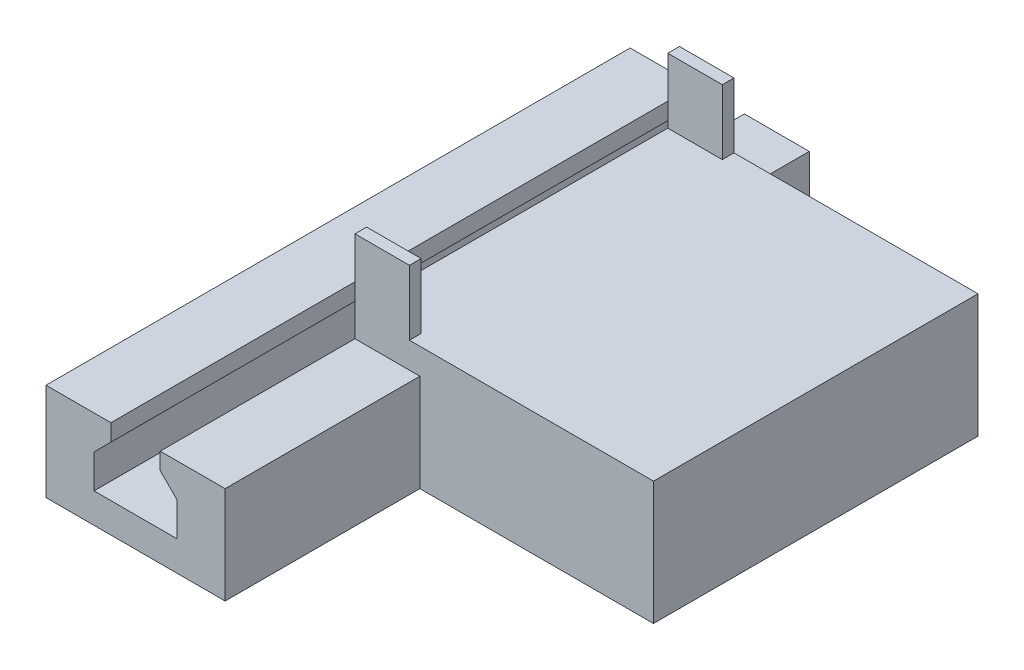
ISO-10303-21;
HEADER;
FILE_DESCRIPTION(('STEP AP214'),'2;1');
FILE_NAME('part.step','',(''),(''),'','','');
FILE_SCHEMA(('AUTOMOTIVE_DESIGN { 1 0 10303 214 1 1 1 1 }'));
ENDSEC;
DATA;
#1=APPLICATION_CONTEXT('core data for automotive mechanical design processes');
#2=APPLICATION_PROTOCOL_DEFINITION('international standard','automotive_design',2000,#1);
#3=PRODUCT_CONTEXT('',#1,'mechanical');
#4=PRODUCT('Part','Part','',(#3));
#5=PRODUCT_RELATED_PRODUCT_CATEGORY('part','',(#4));
#6=PRODUCT_DEFINITION_FORMATION('','',#4);
#7=PRODUCT_DEFINITION_CONTEXT('part definition',#1,'design');
#8=PRODUCT_DEFINITION('design','',#6,#7);
#9=PRODUCT_DEFINITION_SHAPE('','',#8);
#10=(LENGTH_UNIT() NAMED_UNIT(*) SI_UNIT(.MILLI.,.METRE.));
#11=(NAMED_UNIT(*) PLANE_ANGLE_UNIT() SI_UNIT($,.RADIAN.));
#12=(NAMED_UNIT(*) SI_UNIT($,.STERADIAN.) SOLID_ANGLE_UNIT());
#13=UNCERTAINTY_MEASURE_WITH_UNIT(LENGTH_MEASURE(1.E-05),#10,'distance_accuracy_value','');
#14=(GEOMETRIC_REPRESENTATION_CONTEXT(3) GLOBAL_UNCERTAINTY_ASSIGNED_CONTEXT((#13)) GLOBAL_UNIT_ASSIGNED_CONTEXT((#10,
#11,#12)) REPRESENTATION_CONTEXT('',''));
#15=CARTESIAN_POINT('',(0.,0.,0.));
#16=DIRECTION('',(0.,0.,1.));
#17=DIRECTION('',(1.,0.,0.));
#18=AXIS2_PLACEMENT_3D('',#15,#16,#17);
#19=CARTESIAN_POINT('',(0.,7.2,0.));
#20=DIRECTION('',(0.,1.,0.));
#21=DIRECTION('',(-1.,0.,0.));
#22=AXIS2_PLACEMENT_3D('',#19,#20,#21);
#23=PLANE('',#22);
#24=DIRECTION('',(0.,0.,-1.));
#25=VECTOR('',#24,1.);
#26=CARTESIAN_POINT('',(6.1,7.2,5.));
#27=LINE('',#26,#25);
#28=CARTESIAN_POINT('',(6.1,7.2,5.9));
#29=VERTEX_POINT('',#28);
#30=CARTESIAN_POINT('',(6.1,7.2,5.));
#31=VERTEX_POINT('',#30);
#32=EDGE_CURVE('E52',#29,#31,#27,.T.);
#33=ORIENTED_EDGE('',*,*,#32,.F.);
#34=DIRECTION('',(1.,0.,0.));
#35=VECTOR('',#34,1.);
#36=CARTESIAN_POINT('',(1.9,7.2,5.9));
#37=LINE('',#36,#35);
#38=CARTESIAN_POINT('',(1.9,7.2,5.90000000000001));
#39=VERTEX_POINT('',#38);
#40=EDGE_CURVE('E56',#39,#29,#37,.T.);
#41=ORIENTED_EDGE('',*,*,#40,.F.);
#42=DIRECTION('',(0.,0.,1.));
#43=VECTOR('',#42,1.);
#44=CARTESIAN_POINT('',(1.9,7.2,30.));
#45=LINE('',#44,#43);
#46=CARTESIAN_POINT('',(1.9,7.2,29.1));
#47=VERTEX_POINT('',#46);
#48=EDGE_CURVE('E258',#39,#47,#45,.T.);
#49=ORIENTED_EDGE('',*,*,#48,.T.);
#50=DIRECTION('',(-1.,0.,0.));
#51=VECTOR('',#50,1.);
#52=CARTESIAN_POINT('',(1.9,7.2,29.1));
#53=LINE('',#52,#51);
#54=CARTESIAN_POINT('',(6.1,7.2,29.1));
#55=VERTEX_POINT('',#54);
#56=EDGE_CURVE('E232',#55,#47,#53,.T.);
#57=ORIENTED_EDGE('',*,*,#56,.F.);
#58=DIRECTION('',(0.,0.,-1.));
#59=VECTOR('',#58,1.);
#60=CARTESIAN_POINT('',(6.1,7.2,30.));
#61=LINE('',#60,#59);
#62=CARTESIAN_POINT('',(6.1,7.2,30.));
#63=VERTEX_POINT('',#62);
#64=EDGE_CURVE('E239',#63,#55,#61,.T.);
#65=ORIENTED_EDGE('',*,*,#64,.F.);
#66=DIRECTION('',(1.,0.,0.));
#67=VECTOR('',#66,1.);
#68=CARTESIAN_POINT('',(24.9,7.2,30.));
#69=LINE('',#68,#67);
#70=CARTESIAN_POINT('',(24.9,7.2,30.));
#71=VERTEX_POINT('',#70);
#72=EDGE_CURVE('E260',#63,#71,#69,.T.);
#73=ORIENTED_EDGE('',*,*,#72,.T.);
#74=DIRECTION('',(0.,0.,-1.));
#75=VECTOR('',#74,1.);
#76=CARTESIAN_POINT('',(24.9,7.2,30.));
#77=LINE('',#76,#75);
#78=CARTESIAN_POINT('',(24.9,7.2,5.));
#79=VERTEX_POINT('',#78);
#80=EDGE_CURVE('E252',#71,#79,#77,.T.);
#81=ORIENTED_EDGE('',*,*,#80,.T.);
#82=DIRECTION('',(-1.,0.,0.));
#83=VECTOR('',#82,1.);
#84=CARTESIAN_POINT('',(24.9,7.2,5.));
#85=LINE('',#84,#83);
#86=EDGE_CURVE('E255',#79,#31,#85,.T.);
#87=ORIENTED_EDGE('',*,*,#86,.T.);
#88=EDGE_LOOP('',(#33,#41,#49,#57,#65,#73,#81,#87));
#89=FACE_BOUND('',#88,.T.);
#90=ADVANCED_FACE('F37',(#89),#23,.T.);
#91=CARTESIAN_POINT('',(6.9,5.2,45.));
#92=DIRECTION('',(0.,-1.,0.));
#93=DIRECTION('',(1.,0.,0.));
#94=AXIS2_PLACEMENT_3D('',#91,#92,#93);
#95=PLANE('',#94);
#96=DIRECTION('',(-1.,0.,0.));
#97=VECTOR('',#96,1.);
#98=CARTESIAN_POINT('',(24.9,5.2,5.));
#99=LINE('',#98,#97);
#100=CARTESIAN_POINT('',(6.9,5.2,5.));
#101=VERTEX_POINT('',#100);
#102=CARTESIAN_POINT('',(1.9,5.2,5.));
#103=VERTEX_POINT('',#102);
#104=EDGE_CURVE('E202',#101,#103,#99,.T.);
#105=ORIENTED_EDGE('',*,*,#104,.F.);
#106=DIRECTION('',(0.,0.,-1.));
#107=VECTOR('',#106,1.);
#108=CARTESIAN_POINT('',(6.9,5.2,45.));
#109=LINE('',#108,#107);
#110=CARTESIAN_POINT('',(6.9,5.2,0.));
#111=VERTEX_POINT('',#110);
#112=EDGE_CURVE('E345',#101,#111,#109,.T.);
#113=ORIENTED_EDGE('',*,*,#112,.T.);
#114=DIRECTION('',(-1.,0.,0.));
#115=VECTOR('',#114,1.);
#116=CARTESIAN_POINT('',(6.9,5.2,0.));
#117=LINE('',#116,#115);
#118=CARTESIAN_POINT('',(1.9,5.2,0.));
#119=VERTEX_POINT('',#118);
#120=EDGE_CURVE('E330',#111,#119,#117,.T.);
#121=ORIENTED_EDGE('',*,*,#120,.T.);
#122=DIRECTION('',(0.,0.,-1.));
#123=VECTOR('',#122,1.);
#124=CARTESIAN_POINT('',(1.9,5.2,45.));
#125=LINE('',#124,#123);
#126=EDGE_CURVE('E341',#103,#119,#125,.T.);
#127=ORIENTED_EDGE('',*,*,#126,.F.);
#128=EDGE_LOOP('',(#105,#113,#121,#127));
#129=FACE_BOUND('',#128,.T.);
#130=ADVANCED_FACE('F406',(#129),#95,.F.);
#131=DIRECTION('',(1.,0.,0.));
#132=VECTOR('',#131,1.);
#133=CARTESIAN_POINT('',(24.9,5.2,30.));
#134=LINE('',#133,#132);
#135=CARTESIAN_POINT('',(1.9,5.2,30.));
#136=VERTEX_POINT('',#135);
#137=CARTESIAN_POINT('',(6.9,5.2,30.));
#138=VERTEX_POINT('',#137);
#139=EDGE_CURVE('E256',#136,#138,#134,.T.);
#140=ORIENTED_EDGE('',*,*,#139,.F.);
#141=CARTESIAN_POINT('',(1.9,5.2,45.));
#142=VERTEX_POINT('',#141);
#143=EDGE_CURVE('E342',#142,#136,#125,.T.);
#144=ORIENTED_EDGE('',*,*,#143,.F.);
#145=DIRECTION('',(-1.,0.,0.));
#146=VECTOR('',#145,1.);
#147=CARTESIAN_POINT('',(6.9,5.2,45.));
#148=LINE('',#147,#146);
#149=CARTESIAN_POINT('',(6.9,5.2,45.));
#150=VERTEX_POINT('',#149);
#151=EDGE_CURVE('E303',#150,#142,#148,.T.);
#152=ORIENTED_EDGE('',*,*,#151,.F.);
#153=EDGE_CURVE('E346',#150,#138,#109,.T.);
#154=ORIENTED_EDGE('',*,*,#153,.T.);
#155=EDGE_LOOP('',(#140,#144,#152,#154));
#156=FACE_BOUND('',#155,.T.);
#157=ADVANCED_FACE('F438',(#156),#95,.F.);
#158=CARTESIAN_POINT('',(6.9,-2.3,45.));
#159=DIRECTION('',(-1.,0.,0.));
#160=DIRECTION('',(0.,0.,1.));
#161=AXIS2_PLACEMENT_3D('',#158,#159,#160);
#162=PLANE('',#161);
#163=DIRECTION('',(0.,-1.,0.));
#164=VECTOR('',#163,1.);
#165=CARTESIAN_POINT('',(6.9,-2.3,30.));
#166=LINE('',#165,#164);
#167=CARTESIAN_POINT('',(6.9,-2.3,30.));
#168=VERTEX_POINT('',#167);
#169=EDGE_CURVE('E206',#138,#168,#166,.T.);
#170=ORIENTED_EDGE('',*,*,#169,.F.);
#171=ORIENTED_EDGE('',*,*,#153,.F.);
#172=DIRECTION('',(0.,1.,0.));
#173=VECTOR('',#172,1.);
#174=CARTESIAN_POINT('',(6.9,-2.3,45.));
#175=LINE('',#174,#173);
#176=CARTESIAN_POINT('',(6.9,-2.3,45.));
#177=VERTEX_POINT('',#176);
#178=EDGE_CURVE('E301',#177,#150,#175,.T.);
#179=ORIENTED_EDGE('',*,*,#178,.F.);
#180=DIRECTION('',(0.,0.,-1.));
#181=VECTOR('',#180,1.);
#182=CARTESIAN_POINT('',(6.9,-2.3,45.));
#183=LINE('',#182,#181);
#184=EDGE_CURVE('E350',#177,#168,#183,.T.);
#185=ORIENTED_EDGE('',*,*,#184,.T.);
#186=EDGE_LOOP('',(#170,#171,#179,#185));
#187=FACE_BOUND('',#186,.T.);
#188=ADVANCED_FACE('F462',(#187),#162,.F.);
#189=DIRECTION('',(0.,1.,0.));
#190=VECTOR('',#189,1.);
#191=CARTESIAN_POINT('',(6.9,-2.3,5.));
#192=LINE('',#191,#190);
#193=CARTESIAN_POINT('',(6.9,-2.3,5.00000000000001));
#194=VERTEX_POINT('',#193);
#195=EDGE_CURVE('E269',#194,#101,#192,.T.);
#196=ORIENTED_EDGE('',*,*,#195,.F.);
#197=CARTESIAN_POINT('',(6.9,-2.3,0.));
#198=VERTEX_POINT('',#197);
#199=EDGE_CURVE('E349',#194,#198,#183,.T.);
#200=ORIENTED_EDGE('',*,*,#199,.T.);
#201=DIRECTION('',(0.,1.,0.));
#202=VECTOR('',#201,1.);
#203=CARTESIAN_POINT('',(6.9,-2.3,0.));
#204=LINE('',#203,#202);
#205=EDGE_CURVE('E327',#198,#111,#204,.T.);
#206=ORIENTED_EDGE('',*,*,#205,.T.);
#207=ORIENTED_EDGE('',*,*,#112,.F.);
#208=EDGE_LOOP('',(#196,#200,#206,#207));
#209=FACE_BOUND('',#208,.T.);
#210=ADVANCED_FACE('F412',(#209),#162,.F.);
#211=CARTESIAN_POINT('',(3.2,0.,45.));
#212=DIRECTION('',(1.,0.,0.));
#213=DIRECTION('',(0.,0.,-1.));
#214=AXIS2_PLACEMENT_3D('',#211,#212,#213);
#215=PLANE('',#214);
#216=DIRECTION('',(0.,-1.,0.));
#217=VECTOR('',#216,1.);
#218=CARTESIAN_POINT('',(3.2,0.,0.));
#219=LINE('',#218,#217);
#220=CARTESIAN_POINT('',(3.2,2.6,0.));
#221=VERTEX_POINT('',#220);
#222=CARTESIAN_POINT('',(3.2,0.,0.));
#223=VERTEX_POINT('',#222);
#224=EDGE_CURVE('E282',#221,#223,#219,.T.);
#225=ORIENTED_EDGE('',*,*,#224,.T.);
#226=DIRECTION('',(0.,0.,-1.));
#227=VECTOR('',#226,1.);
#228=CARTESIAN_POINT('',(3.2,0.,45.));
#229=LINE('',#228,#227);
#230=CARTESIAN_POINT('',(3.2,0.,45.));
#231=VERTEX_POINT('',#230);
#232=EDGE_CURVE('E11',#231,#223,#229,.T.);
#233=ORIENTED_EDGE('',*,*,#232,.F.);
#234=DIRECTION('',(0.,-1.,0.));
#235=VECTOR('',#234,1.);
#236=CARTESIAN_POINT('',(3.2,0.,45.));
#237=LINE('',#236,#235);
#238=CARTESIAN_POINT('',(3.2,2.6,45.));
#239=VERTEX_POINT('',#238);
#240=EDGE_CURVE('E283',#239,#231,#237,.T.);
#241=ORIENTED_EDGE('',*,*,#240,.F.);
#242=DIRECTION('',(0.,0.,-1.));
#243=VECTOR('',#242,1.);
#244=CARTESIAN_POINT('',(3.2,2.6,45.));
#245=LINE('',#244,#243);
#246=EDGE_CURVE('E309',#239,#221,#245,.T.);
#247=ORIENTED_EDGE('',*,*,#246,.T.);
#248=EDGE_LOOP('',(#225,#233,#241,#247));
#249=FACE_BOUND('',#248,.T.);
#250=ADVANCED_FACE('F39',(#249),#215,.F.);
#251=CARTESIAN_POINT('',(-3.2,0.,45.));
#252=DIRECTION('',(0.,-1.,0.));
#253=DIRECTION('',(0.,0.,-1.));
#254=AXIS2_PLACEMENT_3D('',#251,#252,#253);
#255=PLANE('',#254);
#256=DIRECTION('',(-1.,0.,0.));
#257=VECTOR('',#256,1.);
#258=CARTESIAN_POINT('',(-3.2,0.,0.));
#259=LINE('',#258,#257);
#260=CARTESIAN_POINT('',(-3.2,0.,0.));
#261=VERTEX_POINT('',#260);
#262=EDGE_CURVE('E312',#223,#261,#259,.T.);
#263=ORIENTED_EDGE('',*,*,#262,.T.);
#264=DIRECTION('',(0.,0.,-1.));
#265=VECTOR('',#264,1.);
#266=CARTESIAN_POINT('',(-3.2,0.,45.));
#267=LINE('',#266,#265);
#268=CARTESIAN_POINT('',(-3.2,0.,45.));
#269=VERTEX_POINT('',#268);
#270=EDGE_CURVE('E45',#269,#261,#267,.T.);
#271=ORIENTED_EDGE('',*,*,#270,.F.);
#272=DIRECTION('',(-1.,0.,0.));
#273=VECTOR('',#272,1.);
#274=CARTESIAN_POINT('',(-3.2,0.,45.));
#275=LINE('',#274,#273);
#276=EDGE_CURVE('E286',#231,#269,#275,.T.);
#277=ORIENTED_EDGE('',*,*,#276,.F.);
#278=ORIENTED_EDGE('',*,*,#232,.T.);
#279=EDGE_LOOP('',(#263,#271,#277,#278));
#280=FACE_BOUND('',#279,.T.);
#281=ADVANCED_FACE('F394',(#280),#255,.F.);
#282=CARTESIAN_POINT('',(-3.2,0.,45.));
#283=DIRECTION('',(-1.,0.,0.));
#284=DIRECTION('',(0.,0.,1.));
#285=AXIS2_PLACEMENT_3D('',#282,#283,#284);
#286=PLANE('',#285);
#287=DIRECTION('',(0.,1.,0.));
#288=VECTOR('',#287,1.);
#289=CARTESIAN_POINT('',(-3.2,0.,0.));
#290=LINE('',#289,#288);
#291=CARTESIAN_POINT('',(-3.2,2.6,0.));
#292=VERTEX_POINT('',#291);
#293=EDGE_CURVE('E314',#261,#292,#290,.T.);
#294=ORIENTED_EDGE('',*,*,#293,.T.);
#295=DIRECTION('',(0.,0.,-1.));
#296=VECTOR('',#295,1.);
#297=CARTESIAN_POINT('',(-3.2,2.6,45.));
#298=LINE('',#297,#296);
#299=CARTESIAN_POINT('',(-3.2,2.6,45.));
#300=VERTEX_POINT('',#299);
#301=EDGE_CURVE('E364',#300,#292,#298,.T.);
#302=ORIENTED_EDGE('',*,*,#301,.F.);
#303=DIRECTION('',(0.,1.,0.));
#304=VECTOR('',#303,1.);
#305=CARTESIAN_POINT('',(-3.2,0.,45.));
#306=LINE('',#305,#304);
#307=EDGE_CURVE('E289',#269,#300,#306,.T.);
#308=ORIENTED_EDGE('',*,*,#307,.F.);
#309=ORIENTED_EDGE('',*,*,#270,.T.);
#310=EDGE_LOOP('',(#294,#302,#308,#309));
#311=FACE_BOUND('',#310,.T.);
#312=ADVANCED_FACE('F371',(#311),#286,.F.);
#313=CARTESIAN_POINT('',(-3.2,2.6,45.));
#314=DIRECTION('',(-0.707106781186547,0.707106781186547,0.));
#315=DIRECTION('',(-0.707106781186548,-0.707106781186548,0.));
#316=AXIS2_PLACEMENT_3D('',#313,#314,#315);
#317=PLANE('',#316);
#318=DIRECTION('',(0.707106781186547,0.707106781186547,0.));
#319=VECTOR('',#318,1.);
#320=CARTESIAN_POINT('',(-3.2,2.6,0.));
#321=LINE('',#320,#319);
#322=CARTESIAN_POINT('',(-1.9,3.9,0.));
#323=VERTEX_POINT('',#322);
#324=EDGE_CURVE('E316',#292,#323,#321,.T.);
#325=ORIENTED_EDGE('',*,*,#324,.T.);
#326=DIRECTION('',(0.,0.,-1.));
#327=VECTOR('',#326,1.);
#328=CARTESIAN_POINT('',(-1.9,3.9,45.));
#329=LINE('',#328,#327);
#330=CARTESIAN_POINT('',(-1.9,3.9,45.));
#331=VERTEX_POINT('',#330);
#332=EDGE_CURVE('E361',#331,#323,#329,.T.);
#333=ORIENTED_EDGE('',*,*,#332,.F.);
#334=DIRECTION('',(0.707106781186547,0.707106781186547,0.));
#335=VECTOR('',#334,1.);
#336=CARTESIAN_POINT('',(-3.2,2.6,45.));
#337=LINE('',#336,#335);
#338=EDGE_CURVE('E291',#300,#331,#337,.T.);
#339=ORIENTED_EDGE('',*,*,#338,.F.);
#340=ORIENTED_EDGE('',*,*,#301,.T.);
#341=EDGE_LOOP('',(#325,#333,#339,#340));
#342=FACE_BOUND('',#341,.T.);
#343=ADVANCED_FACE('F382',(#342),#317,.F.);
#344=CARTESIAN_POINT('',(-1.9,5.2,45.));
#345=DIRECTION('',(-1.,0.,0.));
#346=DIRECTION('',(0.,-1.,0.));
#347=AXIS2_PLACEMENT_3D('',#344,#345,#346);
#348=PLANE('',#347);
#349=DIRECTION('',(0.,1.,0.));
#350=VECTOR('',#349,1.);
#351=CARTESIAN_POINT('',(-1.9,5.2,0.));
#352=LINE('',#351,#350);
#353=CARTESIAN_POINT('',(-1.9,5.2,0.));
#354=VERTEX_POINT('',#353);
#355=EDGE_CURVE('E318',#323,#354,#352,.T.);
#356=ORIENTED_EDGE('',*,*,#355,.T.);
#357=DIRECTION('',(0.,0.,-1.));
#358=VECTOR('',#357,1.);
#359=CARTESIAN_POINT('',(-1.9,5.2,45.));
#360=LINE('',#359,#358);
#361=CARTESIAN_POINT('',(-1.9,5.2,45.));
#362=VERTEX_POINT('',#361);
#363=EDGE_CURVE('E358',#362,#354,#360,.T.);
#364=ORIENTED_EDGE('',*,*,#363,.F.);
#365=DIRECTION('',(0.,1.,0.));
#366=VECTOR('',#365,1.);
#367=CARTESIAN_POINT('',(-1.9,5.2,45.));
#368=LINE('',#367,#366);
#369=EDGE_CURVE('E293',#331,#362,#368,.T.);
#370=ORIENTED_EDGE('',*,*,#369,.F.);
#371=ORIENTED_EDGE('',*,*,#332,.T.);
#372=EDGE_LOOP('',(#356,#364,#370,#371));
#373=FACE_BOUND('',#372,.T.);
#374=ADVANCED_FACE('F386',(#373),#348,.F.);
#375=CARTESIAN_POINT('',(-1.9,5.2,45.));
#376=DIRECTION('',(0.,-1.,0.));
#377=DIRECTION('',(1.,0.,0.));
#378=AXIS2_PLACEMENT_3D('',#375,#376,#377);
#379=PLANE('',#378);
#380=DIRECTION('',(-1.,0.,0.));
#381=VECTOR('',#380,1.);
#382=CARTESIAN_POINT('',(-1.9,5.2,0.));
#383=LINE('',#382,#381);
#384=CARTESIAN_POINT('',(-6.9,5.2,0.));
#385=VERTEX_POINT('',#384);
#386=EDGE_CURVE('E320',#354,#385,#383,.T.);
#387=ORIENTED_EDGE('',*,*,#386,.T.);
#388=DIRECTION('',(0.,0.,-1.));
#389=VECTOR('',#388,1.);
#390=CARTESIAN_POINT('',(-6.9,5.2,45.));
#391=LINE('',#390,#389);
#392=CARTESIAN_POINT('',(-6.9,5.2,45.));
#393=VERTEX_POINT('',#392);
#394=EDGE_CURVE('E355',#393,#385,#391,.T.);
#395=ORIENTED_EDGE('',*,*,#394,.F.);
#396=DIRECTION('',(-1.,0.,0.));
#397=VECTOR('',#396,1.);
#398=CARTESIAN_POINT('',(-1.9,5.2,45.));
#399=LINE('',#398,#397);
#400=EDGE_CURVE('E295',#362,#393,#399,.T.);
#401=ORIENTED_EDGE('',*,*,#400,.F.);
#402=ORIENTED_EDGE('',*,*,#363,.T.);
#403=EDGE_LOOP('',(#387,#395,#401,#402));
#404=FACE_BOUND('',#403,.T.);
#405=ADVANCED_FACE('F424',(#404),#379,.F.);
#406=CARTESIAN_POINT('',(-6.9,5.2,45.));
#407=DIRECTION('',(1.,0.,0.));
#408=DIRECTION('',(0.,1.,0.));
#409=AXIS2_PLACEMENT_3D('',#406,#407,#408);
#410=PLANE('',#409);
#411=DIRECTION('',(0.,-1.,0.));
#412=VECTOR('',#411,1.);
#413=CARTESIAN_POINT('',(-6.9,5.2,0.));
#414=LINE('',#413,#412);
#415=CARTESIAN_POINT('',(-6.9,-2.3,0.));
#416=VERTEX_POINT('',#415);
#417=EDGE_CURVE('E322',#385,#416,#414,.T.);
#418=ORIENTED_EDGE('',*,*,#417,.T.);
#419=DIRECTION('',(0.,0.,-1.));
#420=VECTOR('',#419,1.);
#421=CARTESIAN_POINT('',(-6.9,-2.3,45.));
#422=LINE('',#421,#420);
#423=CARTESIAN_POINT('',(-6.9,-2.3,45.));
#424=VERTEX_POINT('',#423);
#425=EDGE_CURVE('E352',#424,#416,#422,.T.);
#426=ORIENTED_EDGE('',*,*,#425,.F.);
#427=DIRECTION('',(0.,-1.,0.));
#428=VECTOR('',#427,1.);
#429=CARTESIAN_POINT('',(-6.9,5.2,45.));
#430=LINE('',#429,#428);
#431=EDGE_CURVE('E297',#393,#424,#430,.T.);
#432=ORIENTED_EDGE('',*,*,#431,.F.);
#433=ORIENTED_EDGE('',*,*,#394,.T.);
#434=EDGE_LOOP('',(#418,#426,#432,#433));
#435=FACE_BOUND('',#434,.T.);
#436=ADVANCED_FACE('F422',(#435),#410,.F.);
#437=CARTESIAN_POINT('',(-6.9,-2.3,45.));
#438=DIRECTION('',(0.,1.,0.));
#439=DIRECTION('',(0.,0.,1.));
#440=AXIS2_PLACEMENT_3D('',#437,#438,#439);
#441=PLANE('',#440);
#442=DIRECTION('',(1.,0.,0.));
#443=VECTOR('',#442,1.);
#444=CARTESIAN_POINT('',(-6.9,-2.3,0.));
#445=LINE('',#444,#443);
#446=EDGE_CURVE('E324',#416,#198,#445,.T.);
#447=ORIENTED_EDGE('',*,*,#446,.T.);
#448=ORIENTED_EDGE('',*,*,#199,.F.);
#449=DIRECTION('',(-1.,0.,0.));
#450=VECTOR('',#449,1.);
#451=CARTESIAN_POINT('',(24.9,-2.3,5.));
#452=LINE('',#451,#450);
#453=CARTESIAN_POINT('',(24.9,-2.3,5.));
#454=VERTEX_POINT('',#453);
#455=EDGE_CURVE('E273',#454,#194,#452,.T.);
#456=ORIENTED_EDGE('',*,*,#455,.F.);
#457=DIRECTION('',(0.,0.,-1.));
#458=VECTOR('',#457,1.);
#459=CARTESIAN_POINT('',(24.9,-2.3,30.));
#460=LINE('',#459,#458);
#461=CARTESIAN_POINT('',(24.9,-2.3,30.));
#462=VERTEX_POINT('',#461);
#463=EDGE_CURVE('E268',#462,#454,#460,.T.);
#464=ORIENTED_EDGE('',*,*,#463,.F.);
#465=DIRECTION('',(-1.,0.,0.));
#466=VECTOR('',#465,1.);
#467=CARTESIAN_POINT('',(24.9,-2.3,30.));
#468=LINE('',#467,#466);
#469=EDGE_CURVE('E279',#462,#168,#468,.T.);
#470=ORIENTED_EDGE('',*,*,#469,.T.);
#471=ORIENTED_EDGE('',*,*,#184,.F.);
#472=DIRECTION('',(1.,0.,0.));
#473=VECTOR('',#472,1.);
#474=CARTESIAN_POINT('',(-6.9,-2.3,45.));
#475=LINE('',#474,#473);
#476=EDGE_CURVE('E299',#424,#177,#475,.T.);
#477=ORIENTED_EDGE('',*,*,#476,.F.);
#478=ORIENTED_EDGE('',*,*,#425,.T.);
#479=EDGE_LOOP('',(#447,#448,#456,#464,#470,#471,#477,#478));
#480=FACE_BOUND('',#479,.T.);
#481=ADVANCED_FACE('F416',(#480),#441,.F.);
#482=CARTESIAN_POINT('',(1.9,5.2,45.));
#483=DIRECTION('',(1.,0.,0.));
#484=DIRECTION('',(0.,0.,-1.));
#485=AXIS2_PLACEMENT_3D('',#482,#483,#484);
#486=PLANE('',#485);
#487=DIRECTION('',(0.,-1.,0.));
#488=VECTOR('',#487,1.);
#489=CARTESIAN_POINT('',(1.9,5.2,0.));
#490=LINE('',#489,#488);
#491=CARTESIAN_POINT('',(1.9,3.9,0.));
#492=VERTEX_POINT('',#491);
#493=EDGE_CURVE('E333',#119,#492,#490,.T.);
#494=ORIENTED_EDGE('',*,*,#493,.T.);
#495=DIRECTION('',(0.,0.,-1.));
#496=VECTOR('',#495,1.);
#497=CARTESIAN_POINT('',(1.9,3.9,45.));
#498=LINE('',#497,#496);
#499=CARTESIAN_POINT('',(1.9,3.9,45.));
#500=VERTEX_POINT('',#499);
#501=EDGE_CURVE('E338',#500,#492,#498,.T.);
#502=ORIENTED_EDGE('',*,*,#501,.F.);
#503=DIRECTION('',(0.,-1.,0.));
#504=VECTOR('',#503,1.);
#505=CARTESIAN_POINT('',(1.9,5.2,45.));
#506=LINE('',#505,#504);
#507=EDGE_CURVE('E305',#142,#500,#506,.T.);
#508=ORIENTED_EDGE('',*,*,#507,.F.);
#509=ORIENTED_EDGE('',*,*,#143,.T.);
#510=DIRECTION('',(0.,-1.,0.));
#511=VECTOR('',#510,1.);
#512=CARTESIAN_POINT('',(1.9,7.2,30.));
#513=LINE('',#512,#511);
#514=CARTESIAN_POINT('',(1.9,12.2,30.));
#515=VERTEX_POINT('',#514);
#516=EDGE_CURVE('E207',#515,#136,#513,.T.);
#517=ORIENTED_EDGE('',*,*,#516,.F.);
#518=DIRECTION('',(0.,0.,1.));
#519=VECTOR('',#518,1.);
#520=CARTESIAN_POINT('',(1.9,12.2,30.));
#521=LINE('',#520,#519);
#522=CARTESIAN_POINT('',(1.9,12.2,29.1));
#523=VERTEX_POINT('',#522);
#524=EDGE_CURVE('E228',#523,#515,#521,.T.);
#525=ORIENTED_EDGE('',*,*,#524,.F.);
#526=DIRECTION('',(0.,-1.,0.));
#527=VECTOR('',#526,1.);
#528=CARTESIAN_POINT('',(1.9,12.2,29.1));
#529=LINE('',#528,#527);
#530=EDGE_CURVE('E238',#523,#47,#529,.T.);
#531=ORIENTED_EDGE('',*,*,#530,.T.);
#532=ORIENTED_EDGE('',*,*,#48,.F.);
#533=DIRECTION('',(0.,-1.,0.));
#534=VECTOR('',#533,1.);
#535=CARTESIAN_POINT('',(1.9,12.2,5.9));
#536=LINE('',#535,#534);
#537=CARTESIAN_POINT('',(1.9,12.2,5.9));
#538=VERTEX_POINT('',#537);
#539=EDGE_CURVE('E221',#538,#39,#536,.T.);
#540=ORIENTED_EDGE('',*,*,#539,.F.);
#541=DIRECTION('',(0.,0.,1.));
#542=VECTOR('',#541,1.);
#543=CARTESIAN_POINT('',(1.9,12.2,5.));
#544=LINE('',#543,#542);
#545=CARTESIAN_POINT('',(1.9,12.2,5.));
#546=VERTEX_POINT('',#545);
#547=EDGE_CURVE('E212',#546,#538,#544,.T.);
#548=ORIENTED_EDGE('',*,*,#547,.F.);
#549=DIRECTION('',(0.,-1.,0.));
#550=VECTOR('',#549,1.);
#551=CARTESIAN_POINT('',(1.9,7.2,5.));
#552=LINE('',#551,#550);
#553=EDGE_CURVE('E196',#546,#103,#552,.T.);
#554=ORIENTED_EDGE('',*,*,#553,.T.);
#555=ORIENTED_EDGE('',*,*,#126,.T.);
#556=EDGE_LOOP('',(#494,#502,#508,#509,#517,#525,#531,#532,#540,#548,#554,#555));
#557=FACE_BOUND('',#556,.T.);
#558=ADVANCED_FACE('F219',(#557),#486,.F.);
#559=CARTESIAN_POINT('',(1.9,3.9,45.));
#560=DIRECTION('',(0.707106781186547,0.707106781186548,0.));
#561=DIRECTION('',(-0.707106781186548,0.707106781186547,0.));
#562=AXIS2_PLACEMENT_3D('',#559,#560,#561);
#563=PLANE('',#562);
#564=DIRECTION('',(0.707106781186548,-0.707106781186547,0.));
#565=VECTOR('',#564,1.);
#566=CARTESIAN_POINT('',(1.9,3.9,0.));
#567=LINE('',#566,#565);
#568=EDGE_CURVE('E287',#492,#221,#567,.T.);
#569=ORIENTED_EDGE('',*,*,#568,.T.);
#570=ORIENTED_EDGE('',*,*,#246,.F.);
#571=DIRECTION('',(0.707106781186548,-0.707106781186547,0.));
#572=VECTOR('',#571,1.);
#573=CARTESIAN_POINT('',(1.9,3.9,45.));
#574=LINE('',#573,#572);
#575=EDGE_CURVE('E307',#500,#239,#574,.T.);
#576=ORIENTED_EDGE('',*,*,#575,.F.);
#577=ORIENTED_EDGE('',*,*,#501,.T.);
#578=EDGE_LOOP('',(#569,#570,#576,#577));
#579=FACE_BOUND('',#578,.T.);
#580=ADVANCED_FACE('F401',(#579),#563,.F.);
#581=CARTESIAN_POINT('',(0.,0.,45.));
#582=DIRECTION('',(0.,0.,1.));
#583=DIRECTION('',(1.,0.,0.));
#584=AXIS2_PLACEMENT_3D('',#581,#582,#583);
#585=PLANE('',#584);
#586=ORIENTED_EDGE('',*,*,#240,.T.);
#587=ORIENTED_EDGE('',*,*,#276,.T.);
#588=ORIENTED_EDGE('',*,*,#307,.T.);
#589=ORIENTED_EDGE('',*,*,#338,.T.);
#590=ORIENTED_EDGE('',*,*,#369,.T.);
#591=ORIENTED_EDGE('',*,*,#400,.T.);
#592=ORIENTED_EDGE('',*,*,#431,.T.);
#593=ORIENTED_EDGE('',*,*,#476,.T.);
#594=ORIENTED_EDGE('',*,*,#178,.T.);
#595=ORIENTED_EDGE('',*,*,#151,.T.);
#596=ORIENTED_EDGE('',*,*,#507,.T.);
#597=ORIENTED_EDGE('',*,*,#575,.T.);
#598=EDGE_LOOP('',(#586,#587,#588,#589,#590,#591,#592,#593,#594,#595,#596,#597));
#599=FACE_BOUND('',#598,.T.);
#600=ADVANCED_FACE('F390',(#599),#585,.T.);
#601=CARTESIAN_POINT('',(0.,0.,0.));
#602=DIRECTION('',(0.,0.,1.));
#603=DIRECTION('',(1.,0.,0.));
#604=AXIS2_PLACEMENT_3D('',#601,#602,#603);
#605=PLANE('',#604);
#606=ORIENTED_EDGE('',*,*,#224,.F.);
#607=ORIENTED_EDGE('',*,*,#568,.F.);
#608=ORIENTED_EDGE('',*,*,#493,.F.);
#609=ORIENTED_EDGE('',*,*,#120,.F.);
#610=ORIENTED_EDGE('',*,*,#205,.F.);
#611=ORIENTED_EDGE('',*,*,#446,.F.);
#612=ORIENTED_EDGE('',*,*,#417,.F.);
#613=ORIENTED_EDGE('',*,*,#386,.F.);
#614=ORIENTED_EDGE('',*,*,#355,.F.);
#615=ORIENTED_EDGE('',*,*,#324,.F.);
#616=ORIENTED_EDGE('',*,*,#293,.F.);
#617=ORIENTED_EDGE('',*,*,#262,.F.);
#618=EDGE_LOOP('',(#606,#607,#608,#609,#610,#611,#612,#613,#614,#615,#616,#617));
#619=FACE_BOUND('',#618,.T.);
#620=ADVANCED_FACE('F377',(#619),#605,.F.);
#621=CARTESIAN_POINT('',(24.9,-2.3,30.));
#622=DIRECTION('',(0.,0.,-1.));
#623=DIRECTION('',(-1.,0.,0.));
#624=AXIS2_PLACEMENT_3D('',#621,#622,#623);
#625=PLANE('',#624);
#626=ORIENTED_EDGE('',*,*,#169,.T.);
#627=ORIENTED_EDGE('',*,*,#469,.F.);
#628=DIRECTION('',(0.,-1.,0.));
#629=VECTOR('',#628,1.);
#630=CARTESIAN_POINT('',(24.9,-2.3,30.));
#631=LINE('',#630,#629);
#632=EDGE_CURVE('E265',#71,#462,#631,.T.);
#633=ORIENTED_EDGE('',*,*,#632,.F.);
#634=ORIENTED_EDGE('',*,*,#72,.F.);
#635=DIRECTION('',(0.,-1.,0.));
#636=VECTOR('',#635,1.);
#637=CARTESIAN_POINT('',(6.1,12.2,30.));
#638=LINE('',#637,#636);
#639=CARTESIAN_POINT('',(6.1,12.2,30.));
#640=VERTEX_POINT('',#639);
#641=EDGE_CURVE('E249',#640,#63,#638,.T.);
#642=ORIENTED_EDGE('',*,*,#641,.F.);
#643=DIRECTION('',(1.,0.,0.));
#644=VECTOR('',#643,1.);
#645=CARTESIAN_POINT('',(1.9,12.2,30.));
#646=LINE('',#645,#644);
#647=EDGE_CURVE('E231',#515,#640,#646,.T.);
#648=ORIENTED_EDGE('',*,*,#647,.F.);
#649=ORIENTED_EDGE('',*,*,#516,.T.);
#650=ORIENTED_EDGE('',*,*,#139,.T.);
#651=EDGE_LOOP('',(#626,#627,#633,#634,#642,#648,#649,#650));
#652=FACE_BOUND('',#651,.T.);
#653=ADVANCED_FACE('F450',(#652),#625,.F.);
#654=CARTESIAN_POINT('',(24.9,-2.3,5.));
#655=DIRECTION('',(0.,0.,1.));
#656=DIRECTION('',(0.,-1.,0.));
#657=AXIS2_PLACEMENT_3D('',#654,#655,#656);
#658=PLANE('',#657);
#659=ORIENTED_EDGE('',*,*,#195,.T.);
#660=ORIENTED_EDGE('',*,*,#104,.T.);
#661=ORIENTED_EDGE('',*,*,#553,.F.);
#662=DIRECTION('',(-1.,0.,0.));
#663=VECTOR('',#662,1.);
#664=CARTESIAN_POINT('',(1.9,12.2,5.));
#665=LINE('',#664,#663);
#666=CARTESIAN_POINT('',(6.1,12.2,5.));
#667=VERTEX_POINT('',#666);
#668=EDGE_CURVE('E201',#667,#546,#665,.T.);
#669=ORIENTED_EDGE('',*,*,#668,.F.);
#670=DIRECTION('',(0.,-1.,0.));
#671=VECTOR('',#670,1.);
#672=CARTESIAN_POINT('',(6.1,12.2,5.));
#673=LINE('',#672,#671);
#674=EDGE_CURVE('E217',#667,#31,#673,.T.);
#675=ORIENTED_EDGE('',*,*,#674,.T.);
#676=ORIENTED_EDGE('',*,*,#86,.F.);
#677=DIRECTION('',(0.,1.,0.));
#678=VECTOR('',#677,1.);
#679=CARTESIAN_POINT('',(24.9,-2.3,5.));
#680=LINE('',#679,#678);
#681=EDGE_CURVE('E271',#454,#79,#680,.T.);
#682=ORIENTED_EDGE('',*,*,#681,.F.);
#683=ORIENTED_EDGE('',*,*,#455,.T.);
#684=EDGE_LOOP('',(#659,#660,#661,#669,#675,#676,#682,#683));
#685=FACE_BOUND('',#684,.T.);
#686=ADVANCED_FACE('F199',(#685),#658,.F.);
#687=CARTESIAN_POINT('',(24.9,0.,0.));
#688=DIRECTION('',(-1.,0.,0.));
#689=DIRECTION('',(0.,0.,1.));
#690=AXIS2_PLACEMENT_3D('',#687,#688,#689);
#691=PLANE('',#690);
#692=ORIENTED_EDGE('',*,*,#632,.T.);
#693=ORIENTED_EDGE('',*,*,#463,.T.);
#694=ORIENTED_EDGE('',*,*,#681,.T.);
#695=ORIENTED_EDGE('',*,*,#80,.F.);
#696=EDGE_LOOP('',(#692,#693,#694,#695));
#697=FACE_BOUND('',#696,.T.);
#698=ADVANCED_FACE('F444',(#697),#691,.F.);
#699=CARTESIAN_POINT('',(6.1,12.2,30.));
#700=DIRECTION('',(-1.,0.,0.));
#701=DIRECTION('',(0.,-1.,0.));
#702=AXIS2_PLACEMENT_3D('',#699,#700,#701);
#703=PLANE('',#702);
#704=ORIENTED_EDGE('',*,*,#64,.T.);
#705=DIRECTION('',(0.,-1.,0.));
#706=VECTOR('',#705,1.);
#707=CARTESIAN_POINT('',(6.1,12.2,29.1));
#708=LINE('',#707,#706);
#709=CARTESIAN_POINT('',(6.1,12.2,29.1));
#710=VERTEX_POINT('',#709);
#711=EDGE_CURVE('E246',#710,#55,#708,.T.);
#712=ORIENTED_EDGE('',*,*,#711,.F.);
#713=DIRECTION('',(0.,0.,-1.));
#714=VECTOR('',#713,1.);
#715=CARTESIAN_POINT('',(6.1,12.2,30.));
#716=LINE('',#715,#714);
#717=EDGE_CURVE('E234',#640,#710,#716,.T.);
#718=ORIENTED_EDGE('',*,*,#717,.F.);
#719=ORIENTED_EDGE('',*,*,#641,.T.);
#720=EDGE_LOOP('',(#704,#712,#718,#719));
#721=FACE_BOUND('',#720,.T.);
#722=ADVANCED_FACE('F442',(#721),#703,.F.);
#723=CARTESIAN_POINT('',(1.9,12.2,29.1));
#724=DIRECTION('',(0.,0.,1.));
#725=DIRECTION('',(1.,0.,0.));
#726=AXIS2_PLACEMENT_3D('',#723,#724,#725);
#727=PLANE('',#726);
#728=ORIENTED_EDGE('',*,*,#56,.T.);
#729=ORIENTED_EDGE('',*,*,#530,.F.);
#730=DIRECTION('',(-1.,0.,0.));
#731=VECTOR('',#730,1.);
#732=CARTESIAN_POINT('',(1.9,12.2,29.1));
#733=LINE('',#732,#731);
#734=EDGE_CURVE('E236',#710,#523,#733,.T.);
#735=ORIENTED_EDGE('',*,*,#734,.F.);
#736=ORIENTED_EDGE('',*,*,#711,.T.);
#737=EDGE_LOOP('',(#728,#729,#735,#736));
#738=FACE_BOUND('',#737,.T.);
#739=ADVANCED_FACE('F507',(#738),#727,.F.);
#740=CARTESIAN_POINT('',(0.,12.2,0.));
#741=DIRECTION('',(0.,-1.,0.));
#742=DIRECTION('',(1.,0.,0.));
#743=AXIS2_PLACEMENT_3D('',#740,#741,#742);
#744=PLANE('',#743);
#745=ORIENTED_EDGE('',*,*,#524,.T.);
#746=ORIENTED_EDGE('',*,*,#647,.T.);
#747=ORIENTED_EDGE('',*,*,#717,.T.);
#748=ORIENTED_EDGE('',*,*,#734,.T.);
#749=EDGE_LOOP('',(#745,#746,#747,#748));
#750=FACE_BOUND('',#749,.T.);
#751=ADVANCED_FACE('F514',(#750),#744,.F.);
#752=CARTESIAN_POINT('',(1.9,12.2,5.9));
#753=DIRECTION('',(0.,0.,-1.));
#754=DIRECTION('',(-1.,0.,0.));
#755=AXIS2_PLACEMENT_3D('',#752,#753,#754);
#756=PLANE('',#755);
#757=ORIENTED_EDGE('',*,*,#40,.T.);
#758=DIRECTION('',(0.,-1.,0.));
#759=VECTOR('',#758,1.);
#760=CARTESIAN_POINT('',(6.1,12.2,5.9));
#761=LINE('',#760,#759);
#762=CARTESIAN_POINT('',(6.1,12.2,5.9));
#763=VERTEX_POINT('',#762);
#764=EDGE_CURVE('E746',#763,#29,#761,.T.);
#765=ORIENTED_EDGE('',*,*,#764,.F.);
#766=DIRECTION('',(1.,0.,0.));
#767=VECTOR('',#766,1.);
#768=CARTESIAN_POINT('',(1.9,12.2,5.9));
#769=LINE('',#768,#767);
#770=EDGE_CURVE('E222',#538,#763,#769,.T.);
#771=ORIENTED_EDGE('',*,*,#770,.F.);
#772=ORIENTED_EDGE('',*,*,#539,.T.);
#773=EDGE_LOOP('',(#757,#765,#771,#772));
#774=FACE_BOUND('',#773,.T.);
#775=ADVANCED_FACE('F521',(#774),#756,.F.);
#776=CARTESIAN_POINT('',(6.1,12.2,5.));
#777=DIRECTION('',(-1.,0.,0.));
#778=DIRECTION('',(0.,-1.,0.));
#779=AXIS2_PLACEMENT_3D('',#776,#777,#778);
#780=PLANE('',#779);
#781=ORIENTED_EDGE('',*,*,#32,.T.);
#782=ORIENTED_EDGE('',*,*,#674,.F.);
#783=DIRECTION('',(0.,0.,-1.));
#784=VECTOR('',#783,1.);
#785=CARTESIAN_POINT('',(6.1,12.2,5.));
#786=LINE('',#785,#784);
#787=EDGE_CURVE('E215',#763,#667,#786,.T.);
#788=ORIENTED_EDGE('',*,*,#787,.F.);
#789=ORIENTED_EDGE('',*,*,#764,.T.);
#790=EDGE_LOOP('',(#781,#782,#788,#789));
#791=FACE_BOUND('',#790,.T.);
#792=ADVANCED_FACE('F529',(#791),#780,.F.);
#793=CARTESIAN_POINT('',(0.,12.2,0.));
#794=DIRECTION('',(0.,1.,0.));
#795=DIRECTION('',(-1.,0.,0.));
#796=AXIS2_PLACEMENT_3D('',#793,#794,#795);
#797=PLANE('',#796);
#798=ORIENTED_EDGE('',*,*,#547,.T.);
#799=ORIENTED_EDGE('',*,*,#770,.T.);
#800=ORIENTED_EDGE('',*,*,#787,.T.);
#801=ORIENTED_EDGE('',*,*,#668,.T.);
#802=EDGE_LOOP('',(#798,#799,#800,#801));
#803=FACE_BOUND('',#802,.T.);
#804=ADVANCED_FACE('F211',(#803),#797,.T.);
#805=CLOSED_SHELL('',(#90,#130,#157,#188,#210,#250,#281,#312,#343,#374,#405,#436,#481,#558,#580,
#600,#620,#653,#686,#698,#722,#739,#751,#775,#792,#804));
#806=MANIFOLD_SOLID_BREP('B2',#805);
#807=ADVANCED_BREP_SHAPE_REPRESENTATION('',(#18,#806),#14);
#808=SHAPE_DEFINITION_REPRESENTATION(#9,#807);
ENDSEC;
END-ISO-10303-21;
